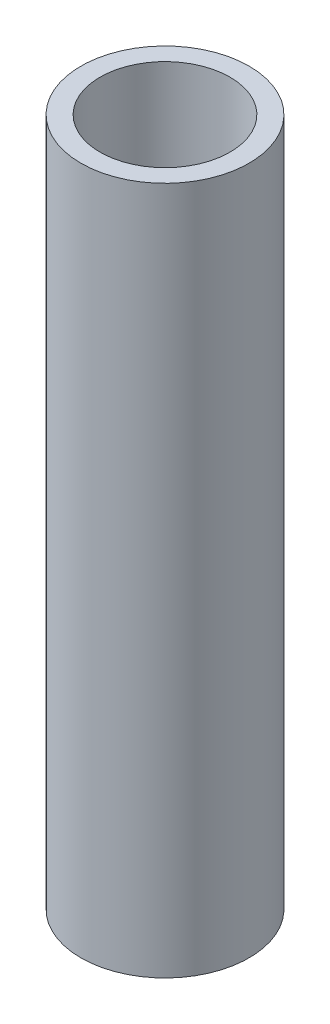
ISO-10303-21;
HEADER;
FILE_DESCRIPTION(('STEP AP214'),'2;1');
FILE_NAME('part.step','',(''),(''),'','','');
FILE_SCHEMA(('AUTOMOTIVE_DESIGN { 1 0 10303 214 1 1 1 1 }'));
ENDSEC;
DATA;
#1=APPLICATION_CONTEXT('core data for automotive mechanical design processes');
#2=APPLICATION_PROTOCOL_DEFINITION('international standard','automotive_design',2000,#1);
#3=PRODUCT_CONTEXT('',#1,'mechanical');
#4=PRODUCT('Part','Part','',(#3));
#5=PRODUCT_RELATED_PRODUCT_CATEGORY('part','',(#4));
#6=PRODUCT_DEFINITION_FORMATION('','',#4);
#7=PRODUCT_DEFINITION_CONTEXT('part definition',#1,'design');
#8=PRODUCT_DEFINITION('design','',#6,#7);
#9=PRODUCT_DEFINITION_SHAPE('','',#8);
#10=(LENGTH_UNIT() NAMED_UNIT(*) SI_UNIT(.MILLI.,.METRE.));
#11=(NAMED_UNIT(*) PLANE_ANGLE_UNIT() SI_UNIT($,.RADIAN.));
#12=(NAMED_UNIT(*) SI_UNIT($,.STERADIAN.) SOLID_ANGLE_UNIT());
#13=UNCERTAINTY_MEASURE_WITH_UNIT(LENGTH_MEASURE(1.E-05),#10,'distance_accuracy_value','');
#14=(GEOMETRIC_REPRESENTATION_CONTEXT(3) GLOBAL_UNCERTAINTY_ASSIGNED_CONTEXT((#13)) GLOBAL_UNIT_ASSIGNED_CONTEXT((#10,
#11,#12)) REPRESENTATION_CONTEXT('',''));
#15=CARTESIAN_POINT('',(0.,0.,0.));
#16=DIRECTION('',(0.,0.,1.));
#17=DIRECTION('',(1.,0.,0.));
#18=AXIS2_PLACEMENT_3D('',#15,#16,#17);
#19=CARTESIAN_POINT('',(0.,90.,0.));
#20=DIRECTION('',(0.,1.,0.));
#21=DIRECTION('',(0.,0.,1.));
#22=AXIS2_PLACEMENT_3D('',#19,#20,#21);
#23=PLANE('',#22);
#24=CARTESIAN_POINT('',(0.,90.,0.));
#25=DIRECTION('',(0.,1.,0.));
#26=DIRECTION('',(0.,0.,1.));
#27=AXIS2_PLACEMENT_3D('',#24,#25,#26);
#28=CIRCLE('',#27,11.);
#29=CARTESIAN_POINT('',(0.,90.,-11.));
#30=VERTEX_POINT('',#29);
#31=EDGE_CURVE('E10',#30,#30,#28,.T.);
#32=ORIENTED_EDGE('',*,*,#31,.T.);
#33=EDGE_LOOP('',(#32));
#34=FACE_BOUND('',#33,.T.);
#35=CARTESIAN_POINT('',(0.,90.,0.));
#36=DIRECTION('',(0.,1.,0.));
#37=DIRECTION('',(0.,0.,1.));
#38=AXIS2_PLACEMENT_3D('',#35,#36,#37);
#39=CIRCLE('',#38,8.5);
#40=CARTESIAN_POINT('',(0.,90.,-8.5));
#41=VERTEX_POINT('',#40);
#42=EDGE_CURVE('E44',#41,#41,#39,.T.);
#43=ORIENTED_EDGE('',*,*,#42,.F.);
#44=EDGE_LOOP('',(#43));
#45=FACE_BOUND('',#44,.T.);
#46=ADVANCED_FACE('F33',(#34,#45),#23,.T.);
#47=CARTESIAN_POINT('',(0.,0.,0.));
#48=DIRECTION('',(0.,1.,0.));
#49=DIRECTION('',(0.,0.,1.));
#50=AXIS2_PLACEMENT_3D('',#47,#48,#49);
#51=PLANE('',#50);
#52=CARTESIAN_POINT('',(0.,0.,0.));
#53=DIRECTION('',(0.,1.,0.));
#54=DIRECTION('',(0.,0.,1.));
#55=AXIS2_PLACEMENT_3D('',#52,#53,#54);
#56=CIRCLE('',#55,11.);
#57=CARTESIAN_POINT('',(0.,0.,-11.));
#58=VERTEX_POINT('',#57);
#59=EDGE_CURVE('E37',#58,#58,#56,.T.);
#60=ORIENTED_EDGE('',*,*,#59,.F.);
#61=EDGE_LOOP('',(#60));
#62=FACE_BOUND('',#61,.T.);
#63=CARTESIAN_POINT('',(0.,0.,0.));
#64=DIRECTION('',(0.,1.,0.));
#65=DIRECTION('',(0.,0.,1.));
#66=AXIS2_PLACEMENT_3D('',#63,#64,#65);
#67=CIRCLE('',#66,8.5);
#68=CARTESIAN_POINT('',(0.,0.,-8.5));
#69=VERTEX_POINT('',#68);
#70=EDGE_CURVE('E46',#69,#69,#67,.T.);
#71=ORIENTED_EDGE('',*,*,#70,.T.);
#72=EDGE_LOOP('',(#71));
#73=FACE_BOUND('',#72,.T.);
#74=ADVANCED_FACE('F56',(#62,#73),#51,.F.);
#75=CARTESIAN_POINT('',(0.,90.,0.));
#76=DIRECTION('',(0.,-1.,0.));
#77=DIRECTION('',(0.,0.,-1.));
#78=AXIS2_PLACEMENT_3D('',#75,#76,#77);
#79=CYLINDRICAL_SURFACE('',#78,11.);
#80=CARTESIAN_POINT('',(0.,90.,-11.));
#81=CARTESIAN_POINT('',(0.,89.0625,-11.));
#82=CARTESIAN_POINT('',(0.,88.125,-11.));
#83=CARTESIAN_POINT('',(0.,86.25,-11.));
#84=CARTESIAN_POINT('',(0.,85.3125,-11.));
#85=CARTESIAN_POINT('',(0.,83.4375,-11.));
#86=CARTESIAN_POINT('',(0.,82.5,-11.));
#87=CARTESIAN_POINT('',(0.,80.625,-11.));
#88=CARTESIAN_POINT('',(0.,79.6875,-11.));
#89=CARTESIAN_POINT('',(0.,77.8125,-11.));
#90=CARTESIAN_POINT('',(0.,76.875,-11.));
#91=CARTESIAN_POINT('',(0.,75.,-11.));
#92=CARTESIAN_POINT('',(0.,74.0625,-11.));
#93=CARTESIAN_POINT('',(0.,72.1875,-11.));
#94=CARTESIAN_POINT('',(0.,71.25,-11.));
#95=CARTESIAN_POINT('',(0.,69.375,-11.));
#96=CARTESIAN_POINT('',(0.,68.4375,-11.));
#97=CARTESIAN_POINT('',(0.,66.5625,-11.));
#98=CARTESIAN_POINT('',(0.,65.625,-11.));
#99=CARTESIAN_POINT('',(0.,63.75,-11.));
#100=CARTESIAN_POINT('',(0.,62.8125,-11.));
#101=CARTESIAN_POINT('',(0.,60.9375,-11.));
#102=CARTESIAN_POINT('',(0.,60.,-11.));
#103=CARTESIAN_POINT('',(0.,58.125,-11.));
#104=CARTESIAN_POINT('',(0.,57.1875,-11.));
#105=CARTESIAN_POINT('',(0.,55.3125,-11.));
#106=CARTESIAN_POINT('',(0.,54.375,-11.));
#107=CARTESIAN_POINT('',(0.,52.5,-11.));
#108=CARTESIAN_POINT('',(0.,51.5625,-11.));
#109=CARTESIAN_POINT('',(0.,49.6875,-11.));
#110=CARTESIAN_POINT('',(0.,48.75,-11.));
#111=CARTESIAN_POINT('',(0.,46.875,-11.));
#112=CARTESIAN_POINT('',(0.,45.9375,-11.));
#113=CARTESIAN_POINT('',(0.,44.0625,-11.));
#114=CARTESIAN_POINT('',(0.,43.125,-11.));
#115=CARTESIAN_POINT('',(0.,41.25,-11.));
#116=CARTESIAN_POINT('',(0.,40.3125,-11.));
#117=CARTESIAN_POINT('',(0.,38.4375,-11.));
#118=CARTESIAN_POINT('',(0.,37.5,-11.));
#119=CARTESIAN_POINT('',(0.,35.625,-11.));
#120=CARTESIAN_POINT('',(0.,34.6875,-11.));
#121=CARTESIAN_POINT('',(0.,32.8125,-11.));
#122=CARTESIAN_POINT('',(0.,31.875,-11.));
#123=CARTESIAN_POINT('',(0.,30.,-11.));
#124=CARTESIAN_POINT('',(0.,29.0625,-11.));
#125=CARTESIAN_POINT('',(0.,27.1875,-11.));
#126=CARTESIAN_POINT('',(0.,26.25,-11.));
#127=CARTESIAN_POINT('',(0.,24.375,-11.));
#128=CARTESIAN_POINT('',(0.,23.4375,-11.));
#129=CARTESIAN_POINT('',(0.,21.5625,-11.));
#130=CARTESIAN_POINT('',(0.,20.625,-11.));
#131=CARTESIAN_POINT('',(0.,18.75,-11.));
#132=CARTESIAN_POINT('',(0.,17.8125,-11.));
#133=CARTESIAN_POINT('',(0.,15.9375,-11.));
#134=CARTESIAN_POINT('',(0.,15.,-11.));
#135=CARTESIAN_POINT('',(0.,13.125,-11.));
#136=CARTESIAN_POINT('',(0.,12.1875,-11.));
#137=CARTESIAN_POINT('',(0.,10.3125,-11.));
#138=CARTESIAN_POINT('',(0.,9.37499999999999,-11.));
#139=CARTESIAN_POINT('',(0.,7.49999999999999,-11.));
#140=CARTESIAN_POINT('',(0.,6.56249999999999,-11.));
#141=CARTESIAN_POINT('',(0.,4.68749999999999,-11.));
#142=CARTESIAN_POINT('',(0.,3.74999999999998,-11.));
#143=CARTESIAN_POINT('',(0.,1.87499999999998,-11.));
#144=CARTESIAN_POINT('',(0.,0.937499999999986,-11.));
#145=CARTESIAN_POINT('',(0.,0.,-11.));
#146=B_SPLINE_CURVE_WITH_KNOTS('',3,(#80,#81,#82,#83,#84,#85,#86,#87,#88,#89,#90,#91,#92,#93,
#94,#95,#96,#97,#98,#99,#100,#101,#102,#103,#104,#105,#106,#107,#108,#109,#110,#111,#112,#113,
#114,#115,#116,#117,#118,#119,#120,#121,#122,#123,#124,#125,#126,#127,#128,#129,#130,#131,#132,
#133,#134,#135,#136,#137,#138,#139,#140,#141,#142,#143,#144,#145),.UNSPECIFIED.,.F.,.F.,(4,2,2,
2,2,2,2,2,2,2,2,2,2,2,2,2,2,2,2,2,2,2,2,2,2,2,2,2,2,2,2,2,4),(0.,2.81250000000001,
5.62500000000001,8.43750000000001,11.25,14.0625,16.875,19.6875,22.5,25.3125,28.125,30.9375,
33.75,36.5625,39.375,42.1875,45.,47.8125,50.625,53.4375,56.25,59.0625,61.875,64.6875,67.5,
70.3125,73.125,75.9375,78.75,81.5625,84.375,87.1875,90.),.UNSPECIFIED.);
#147=EDGE_CURVE('BSEAM35',#30,#58,#146,.T.);
#148=ORIENTED_EDGE('',*,*,#31,.F.);
#149=ORIENTED_EDGE('',*,*,#59,.T.);
#150=ORIENTED_EDGE('',*,*,#147,.T.);
#151=ORIENTED_EDGE('',*,*,#147,.F.);
#152=EDGE_LOOP('',(#148,#150,#149,#151));
#153=FACE_BOUND('',#152,.T.);
#154=ADVANCED_FACE('F35',(#153),#79,.T.);
#155=CARTESIAN_POINT('',(0.,90.,0.));
#156=DIRECTION('',(0.,-1.,0.));
#157=DIRECTION('',(0.,0.,-1.));
#158=AXIS2_PLACEMENT_3D('',#155,#156,#157);
#159=CYLINDRICAL_SURFACE('',#158,8.5);
#160=CARTESIAN_POINT('',(0.,90.,-8.5));
#161=CARTESIAN_POINT('',(0.,89.0625,-8.5));
#162=CARTESIAN_POINT('',(0.,88.125,-8.5));
#163=CARTESIAN_POINT('',(0.,86.25,-8.5));
#164=CARTESIAN_POINT('',(0.,85.3125,-8.5));
#165=CARTESIAN_POINT('',(0.,83.4375,-8.5));
#166=CARTESIAN_POINT('',(0.,82.5,-8.5));
#167=CARTESIAN_POINT('',(0.,80.625,-8.5));
#168=CARTESIAN_POINT('',(0.,79.6875,-8.5));
#169=CARTESIAN_POINT('',(0.,77.8125,-8.5));
#170=CARTESIAN_POINT('',(0.,76.875,-8.5));
#171=CARTESIAN_POINT('',(0.,75.,-8.5));
#172=CARTESIAN_POINT('',(0.,74.0625,-8.5));
#173=CARTESIAN_POINT('',(0.,72.1875,-8.5));
#174=CARTESIAN_POINT('',(0.,71.25,-8.5));
#175=CARTESIAN_POINT('',(0.,69.375,-8.5));
#176=CARTESIAN_POINT('',(0.,68.4375,-8.5));
#177=CARTESIAN_POINT('',(0.,66.5625,-8.5));
#178=CARTESIAN_POINT('',(0.,65.625,-8.5));
#179=CARTESIAN_POINT('',(0.,63.75,-8.5));
#180=CARTESIAN_POINT('',(0.,62.8125,-8.5));
#181=CARTESIAN_POINT('',(0.,60.9375,-8.5));
#182=CARTESIAN_POINT('',(0.,60.,-8.5));
#183=CARTESIAN_POINT('',(0.,58.125,-8.5));
#184=CARTESIAN_POINT('',(0.,57.1875,-8.5));
#185=CARTESIAN_POINT('',(0.,55.3125,-8.5));
#186=CARTESIAN_POINT('',(0.,54.375,-8.5));
#187=CARTESIAN_POINT('',(0.,52.5,-8.5));
#188=CARTESIAN_POINT('',(0.,51.5625,-8.5));
#189=CARTESIAN_POINT('',(0.,49.6875,-8.5));
#190=CARTESIAN_POINT('',(0.,48.75,-8.5));
#191=CARTESIAN_POINT('',(0.,46.875,-8.5));
#192=CARTESIAN_POINT('',(0.,45.9375,-8.5));
#193=CARTESIAN_POINT('',(0.,44.0625,-8.5));
#194=CARTESIAN_POINT('',(0.,43.125,-8.5));
#195=CARTESIAN_POINT('',(0.,41.25,-8.5));
#196=CARTESIAN_POINT('',(0.,40.3125,-8.5));
#197=CARTESIAN_POINT('',(0.,38.4375,-8.5));
#198=CARTESIAN_POINT('',(0.,37.5,-8.5));
#199=CARTESIAN_POINT('',(0.,35.625,-8.5));
#200=CARTESIAN_POINT('',(0.,34.6875,-8.5));
#201=CARTESIAN_POINT('',(0.,32.8125,-8.5));
#202=CARTESIAN_POINT('',(0.,31.875,-8.5));
#203=CARTESIAN_POINT('',(0.,30.,-8.5));
#204=CARTESIAN_POINT('',(0.,29.0625,-8.5));
#205=CARTESIAN_POINT('',(0.,27.1875,-8.5));
#206=CARTESIAN_POINT('',(0.,26.25,-8.5));
#207=CARTESIAN_POINT('',(0.,24.375,-8.5));
#208=CARTESIAN_POINT('',(0.,23.4375,-8.5));
#209=CARTESIAN_POINT('',(0.,21.5625,-8.5));
#210=CARTESIAN_POINT('',(0.,20.625,-8.5));
#211=CARTESIAN_POINT('',(0.,18.75,-8.5));
#212=CARTESIAN_POINT('',(0.,17.8125,-8.5));
#213=CARTESIAN_POINT('',(0.,15.9375,-8.5));
#214=CARTESIAN_POINT('',(0.,15.,-8.5));
#215=CARTESIAN_POINT('',(0.,13.125,-8.5));
#216=CARTESIAN_POINT('',(0.,12.1875,-8.5));
#217=CARTESIAN_POINT('',(0.,10.3125,-8.5));
#218=CARTESIAN_POINT('',(0.,9.37499999999999,-8.5));
#219=CARTESIAN_POINT('',(0.,7.49999999999999,-8.5));
#220=CARTESIAN_POINT('',(0.,6.56249999999999,-8.5));
#221=CARTESIAN_POINT('',(0.,4.68749999999999,-8.5));
#222=CARTESIAN_POINT('',(0.,3.74999999999998,-8.5));
#223=CARTESIAN_POINT('',(0.,1.87499999999998,-8.5));
#224=CARTESIAN_POINT('',(0.,0.937499999999986,-8.5));
#225=CARTESIAN_POINT('',(0.,0.,-8.5));
#226=B_SPLINE_CURVE_WITH_KNOTS('',3,(#160,#161,#162,#163,#164,#165,#166,#167,#168,#169,#170,
#171,#172,#173,#174,#175,#176,#177,#178,#179,#180,#181,#182,#183,#184,#185,#186,#187,#188,#189,
#190,#191,#192,#193,#194,#195,#196,#197,#198,#199,#200,#201,#202,#203,#204,#205,#206,#207,#208,
#209,#210,#211,#212,#213,#214,#215,#216,#217,#218,#219,#220,#221,#222,#223,#224,#225),
.UNSPECIFIED.,.F.,.F.,(4,2,2,2,2,2,2,2,2,2,2,2,2,2,2,2,2,2,2,2,2,2,2,2,2,2,2,2,2,2,2,2,4),(0.,
2.81250000000001,5.62500000000001,8.43750000000001,11.25,14.0625,16.875,19.6875,22.5,25.3125,
28.125,30.9375,33.75,36.5625,39.375,42.1875,45.,47.8125,50.625,53.4375,56.25,59.0625,61.875,
64.6875,67.5,70.3125,73.125,75.9375,78.75,81.5625,84.375,87.1875,90.),.UNSPECIFIED.);
#227=EDGE_CURVE('BSEAM52',#41,#69,#226,.T.);
#228=ORIENTED_EDGE('',*,*,#42,.T.);
#229=ORIENTED_EDGE('',*,*,#70,.F.);
#230=ORIENTED_EDGE('',*,*,#227,.T.);
#231=ORIENTED_EDGE('',*,*,#227,.F.);
#232=EDGE_LOOP('',(#228,#230,#229,#231));
#233=FACE_BOUND('',#232,.T.);
#234=ADVANCED_FACE('F52',(#233),#159,.F.);
#235=CLOSED_SHELL('',(#46,#74,#154,#234));
#236=MANIFOLD_SOLID_BREP('B2',#235);
#237=ADVANCED_BREP_SHAPE_REPRESENTATION('',(#18,#236),#14);
#238=SHAPE_DEFINITION_REPRESENTATION(#9,#237);
ENDSEC;
END-ISO-10303-21;
